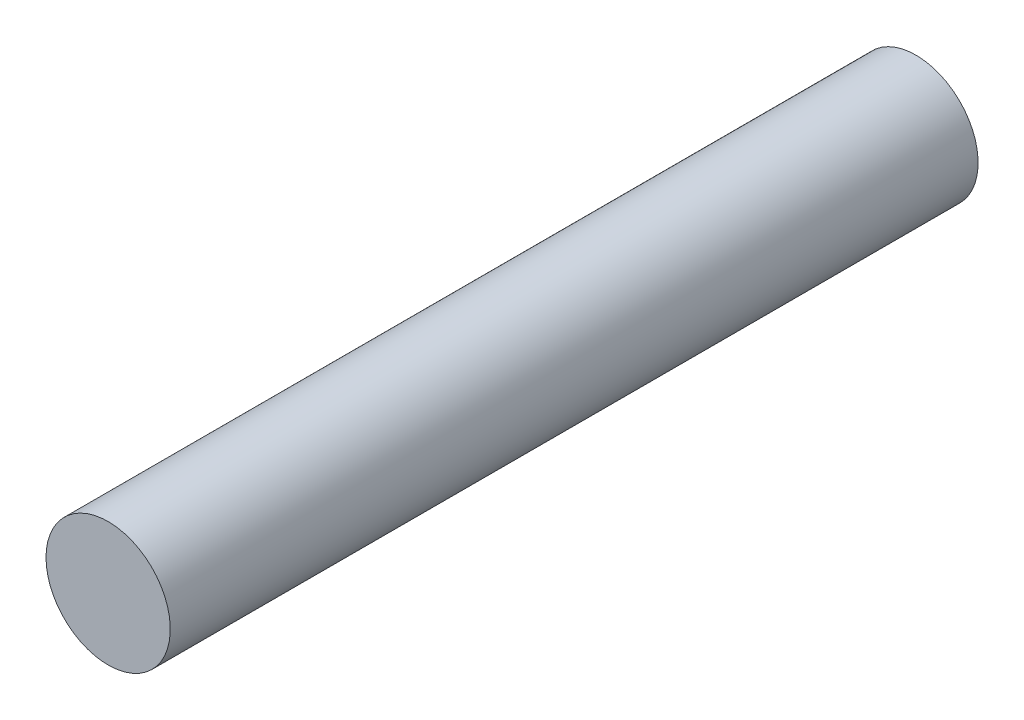
ISO-10303-21;
HEADER;
FILE_DESCRIPTION(('STEP AP214'),'2;1');
FILE_NAME('part.step','',(''),(''),'','','');
FILE_SCHEMA(('AUTOMOTIVE_DESIGN { 1 0 10303 214 1 1 1 1 }'));
ENDSEC;
DATA;
#1=APPLICATION_CONTEXT('core data for automotive mechanical design processes');
#2=APPLICATION_PROTOCOL_DEFINITION('international standard','automotive_design',2000,#1);
#3=PRODUCT_CONTEXT('',#1,'mechanical');
#4=PRODUCT('Part','Part','',(#3));
#5=PRODUCT_RELATED_PRODUCT_CATEGORY('part','',(#4));
#6=PRODUCT_DEFINITION_FORMATION('','',#4);
#7=PRODUCT_DEFINITION_CONTEXT('part definition',#1,'design');
#8=PRODUCT_DEFINITION('design','',#6,#7);
#9=PRODUCT_DEFINITION_SHAPE('','',#8);
#10=(LENGTH_UNIT() NAMED_UNIT(*) SI_UNIT(.MILLI.,.METRE.));
#11=(NAMED_UNIT(*) PLANE_ANGLE_UNIT() SI_UNIT($,.RADIAN.));
#12=(NAMED_UNIT(*) SI_UNIT($,.STERADIAN.) SOLID_ANGLE_UNIT());
#13=UNCERTAINTY_MEASURE_WITH_UNIT(LENGTH_MEASURE(1.E-05),#10,'distance_accuracy_value','');
#14=(GEOMETRIC_REPRESENTATION_CONTEXT(3) GLOBAL_UNCERTAINTY_ASSIGNED_CONTEXT((#13)) GLOBAL_UNIT_ASSIGNED_CONTEXT((#10,
#11,#12)) REPRESENTATION_CONTEXT('',''));
#15=CARTESIAN_POINT('',(0.,0.,0.));
#16=DIRECTION('',(0.,0.,1.));
#17=DIRECTION('',(1.,0.,0.));
#18=AXIS2_PLACEMENT_3D('',#15,#16,#17);
#19=CARTESIAN_POINT('',(-50.6256909984125,32.5476607042295,13.));
#20=DIRECTION('',(0.,0.,-1.));
#21=DIRECTION('',(-1.,0.,0.));
#22=AXIS2_PLACEMENT_3D('',#19,#20,#21);
#23=CYLINDRICAL_SURFACE('',#22,0.999999999999998);
#24=CARTESIAN_POINT('',(-50.6256909984125,32.5476607042295,13.));
#25=DIRECTION('',(0.,0.,1.));
#26=DIRECTION('',(1.,0.,0.));
#27=AXIS2_PLACEMENT_3D('',#24,#25,#26);
#28=CIRCLE('',#27,0.999999999999998);
#29=CARTESIAN_POINT('',(-51.6256909984125,32.5476607042295,13.));
#30=VERTEX_POINT('',#29);
#31=EDGE_CURVE('E10',#30,#30,#28,.T.);
#32=CARTESIAN_POINT('',(-50.6256909984125,32.5476607042295,0.));
#33=DIRECTION('',(0.,0.,1.));
#34=DIRECTION('',(1.,0.,0.));
#35=AXIS2_PLACEMENT_3D('',#32,#33,#34);
#36=CIRCLE('',#35,0.999999999999998);
#37=CARTESIAN_POINT('',(-51.6256909984125,32.5476607042295,0.));
#38=VERTEX_POINT('',#37);
#39=EDGE_CURVE('E35',#38,#38,#36,.T.);
#40=CARTESIAN_POINT('',(-51.6256909984125,32.5476607042295,13.));
#41=CARTESIAN_POINT('',(-51.6256909984125,32.5476607042295,12.8645833333333));
#42=CARTESIAN_POINT('',(-51.6256909984125,32.5476607042295,12.7291666666667));
#43=CARTESIAN_POINT('',(-51.6256909984125,32.5476607042295,12.4583333333333));
#44=CARTESIAN_POINT('',(-51.6256909984125,32.5476607042295,12.3229166666667));
#45=CARTESIAN_POINT('',(-51.6256909984125,32.5476607042295,12.0520833333333));
#46=CARTESIAN_POINT('',(-51.6256909984125,32.5476607042295,11.9166666666667));
#47=CARTESIAN_POINT('',(-51.6256909984125,32.5476607042295,11.6458333333333));
#48=CARTESIAN_POINT('',(-51.6256909984125,32.5476607042295,11.5104166666667));
#49=CARTESIAN_POINT('',(-51.6256909984125,32.5476607042295,11.2395833333333));
#50=CARTESIAN_POINT('',(-51.6256909984125,32.5476607042295,11.1041666666667));
#51=CARTESIAN_POINT('',(-51.6256909984125,32.5476607042295,10.8333333333333));
#52=CARTESIAN_POINT('',(-51.6256909984125,32.5476607042295,10.6979166666667));
#53=CARTESIAN_POINT('',(-51.6256909984125,32.5476607042295,10.4270833333333));
#54=CARTESIAN_POINT('',(-51.6256909984125,32.5476607042295,10.2916666666667));
#55=CARTESIAN_POINT('',(-51.6256909984125,32.5476607042295,10.0208333333333));
#56=CARTESIAN_POINT('',(-51.6256909984125,32.5476607042295,9.88541666666667));
#57=CARTESIAN_POINT('',(-51.6256909984125,32.5476607042295,9.61458333333333));
#58=CARTESIAN_POINT('',(-51.6256909984125,32.5476607042295,9.47916666666667));
#59=CARTESIAN_POINT('',(-51.6256909984125,32.5476607042295,9.20833333333333));
#60=CARTESIAN_POINT('',(-51.6256909984125,32.5476607042295,9.07291666666666));
#61=CARTESIAN_POINT('',(-51.6256909984125,32.5476607042295,8.80208333333333));
#62=CARTESIAN_POINT('',(-51.6256909984125,32.5476607042295,8.66666666666667));
#63=CARTESIAN_POINT('',(-51.6256909984125,32.5476607042295,8.39583333333333));
#64=CARTESIAN_POINT('',(-51.6256909984125,32.5476607042295,8.26041666666667));
#65=CARTESIAN_POINT('',(-51.6256909984125,32.5476607042295,7.98958333333333));
#66=CARTESIAN_POINT('',(-51.6256909984125,32.5476607042295,7.85416666666667));
#67=CARTESIAN_POINT('',(-51.6256909984125,32.5476607042295,7.58333333333333));
#68=CARTESIAN_POINT('',(-51.6256909984125,32.5476607042295,7.44791666666667));
#69=CARTESIAN_POINT('',(-51.6256909984125,32.5476607042295,7.17708333333333));
#70=CARTESIAN_POINT('',(-51.6256909984125,32.5476607042295,7.04166666666667));
#71=CARTESIAN_POINT('',(-51.6256909984125,32.5476607042295,6.77083333333333));
#72=CARTESIAN_POINT('',(-51.6256909984125,32.5476607042295,6.63541666666667));
#73=CARTESIAN_POINT('',(-51.6256909984125,32.5476607042295,6.36458333333333));
#74=CARTESIAN_POINT('',(-51.6256909984125,32.5476607042295,6.22916666666667));
#75=CARTESIAN_POINT('',(-51.6256909984125,32.5476607042295,5.95833333333333));
#76=CARTESIAN_POINT('',(-51.6256909984125,32.5476607042295,5.82291666666667));
#77=CARTESIAN_POINT('',(-51.6256909984125,32.5476607042295,5.55208333333333));
#78=CARTESIAN_POINT('',(-51.6256909984125,32.5476607042295,5.41666666666667));
#79=CARTESIAN_POINT('',(-51.6256909984125,32.5476607042295,5.14583333333333));
#80=CARTESIAN_POINT('',(-51.6256909984125,32.5476607042295,5.01041666666667));
#81=CARTESIAN_POINT('',(-51.6256909984125,32.5476607042295,4.73958333333333));
#82=CARTESIAN_POINT('',(-51.6256909984125,32.5476607042295,4.60416666666667));
#83=CARTESIAN_POINT('',(-51.6256909984125,32.5476607042295,4.33333333333333));
#84=CARTESIAN_POINT('',(-51.6256909984125,32.5476607042295,4.19791666666667));
#85=CARTESIAN_POINT('',(-51.6256909984125,32.5476607042295,3.92708333333333));
#86=CARTESIAN_POINT('',(-51.6256909984125,32.5476607042295,3.79166666666667));
#87=CARTESIAN_POINT('',(-51.6256909984125,32.5476607042295,3.52083333333333));
#88=CARTESIAN_POINT('',(-51.6256909984125,32.5476607042295,3.38541666666667));
#89=CARTESIAN_POINT('',(-51.6256909984125,32.5476607042295,3.11458333333333));
#90=CARTESIAN_POINT('',(-51.6256909984125,32.5476607042295,2.97916666666667));
#91=CARTESIAN_POINT('',(-51.6256909984125,32.5476607042295,2.70833333333333));
#92=CARTESIAN_POINT('',(-51.6256909984125,32.5476607042295,2.57291666666667));
#93=CARTESIAN_POINT('',(-51.6256909984125,32.5476607042295,2.30208333333333));
#94=CARTESIAN_POINT('',(-51.6256909984125,32.5476607042295,2.16666666666667));
#95=CARTESIAN_POINT('',(-51.6256909984125,32.5476607042295,1.89583333333333));
#96=CARTESIAN_POINT('',(-51.6256909984125,32.5476607042295,1.76041666666667));
#97=CARTESIAN_POINT('',(-51.6256909984125,32.5476607042295,1.48958333333333));
#98=CARTESIAN_POINT('',(-51.6256909984125,32.5476607042295,1.35416666666667));
#99=CARTESIAN_POINT('',(-51.6256909984125,32.5476607042295,1.08333333333333));
#100=CARTESIAN_POINT('',(-51.6256909984125,32.5476607042295,0.947916666666667));
#101=CARTESIAN_POINT('',(-51.6256909984125,32.5476607042295,0.677083333333334));
#102=CARTESIAN_POINT('',(-51.6256909984125,32.5476607042295,0.541666666666667));
#103=CARTESIAN_POINT('',(-51.6256909984125,32.5476607042295,0.270833333333334));
#104=CARTESIAN_POINT('',(-51.6256909984125,32.5476607042295,0.135416666666667));
#105=CARTESIAN_POINT('',(-51.6256909984125,32.5476607042295,0.));
#106=B_SPLINE_CURVE_WITH_KNOTS('',3,(#40,#41,#42,#43,#44,#45,#46,#47,#48,#49,#50,#51,#52,#53,
#54,#55,#56,#57,#58,#59,#60,#61,#62,#63,#64,#65,#66,#67,#68,#69,#70,#71,#72,#73,#74,#75,#76,#77,
#78,#79,#80,#81,#82,#83,#84,#85,#86,#87,#88,#89,#90,#91,#92,#93,#94,#95,#96,#97,#98,#99,#100,
#101,#102,#103,#104,#105),.UNSPECIFIED.,.F.,.F.,(4,2,2,2,2,2,2,2,2,2,2,2,2,2,2,2,2,2,2,2,2,2,2,
2,2,2,2,2,2,2,2,2,4),(0.,0.40625,0.812500000000001,1.21875,1.625,2.03125,2.4375,2.84375,3.25,
3.65625,4.0625,4.46875,4.875,5.28125,5.6875,6.09375,6.5,6.90625,7.3125,7.71875,8.125,8.53125,
8.9375,9.34375,9.75,10.15625,10.5625,10.96875,11.375,11.78125,12.1875,12.59375,13.),.UNSPECIFIED.);
#107=EDGE_CURVE('BSEAM32',#30,#38,#106,.T.);
#108=ORIENTED_EDGE('',*,*,#31,.F.);
#109=ORIENTED_EDGE('',*,*,#39,.T.);
#110=ORIENTED_EDGE('',*,*,#107,.T.);
#111=ORIENTED_EDGE('',*,*,#107,.F.);
#112=EDGE_LOOP('',(#108,#110,#109,#111));
#113=FACE_BOUND('',#112,.T.);
#114=ADVANCED_FACE('F32',(#113),#23,.T.);
#115=CARTESIAN_POINT('',(-50.6256909984125,32.5476607042295,13.));
#116=DIRECTION('',(0.,0.,1.));
#117=DIRECTION('',(1.,0.,0.));
#118=AXIS2_PLACEMENT_3D('',#115,#116,#117);
#119=PLANE('',#118);
#120=ORIENTED_EDGE('',*,*,#31,.T.);
#121=EDGE_LOOP('',(#120));
#122=FACE_BOUND('',#121,.T.);
#123=ADVANCED_FACE('F47',(#122),#119,.T.);
#124=CARTESIAN_POINT('',(-50.6256909984125,32.5476607042295,0.));
#125=DIRECTION('',(0.,0.,1.));
#126=DIRECTION('',(1.,0.,0.));
#127=AXIS2_PLACEMENT_3D('',#124,#125,#126);
#128=PLANE('',#127);
#129=ORIENTED_EDGE('',*,*,#39,.F.);
#130=EDGE_LOOP('',(#129));
#131=FACE_BOUND('',#130,.T.);
#132=ADVANCED_FACE('F45',(#131),#128,.F.);
#133=CLOSED_SHELL('',(#114,#123,#132));
#134=MANIFOLD_SOLID_BREP('B2',#133);
#135=ADVANCED_BREP_SHAPE_REPRESENTATION('',(#18,#134),#14);
#136=SHAPE_DEFINITION_REPRESENTATION(#9,#135);
ENDSEC;
END-ISO-10303-21;
